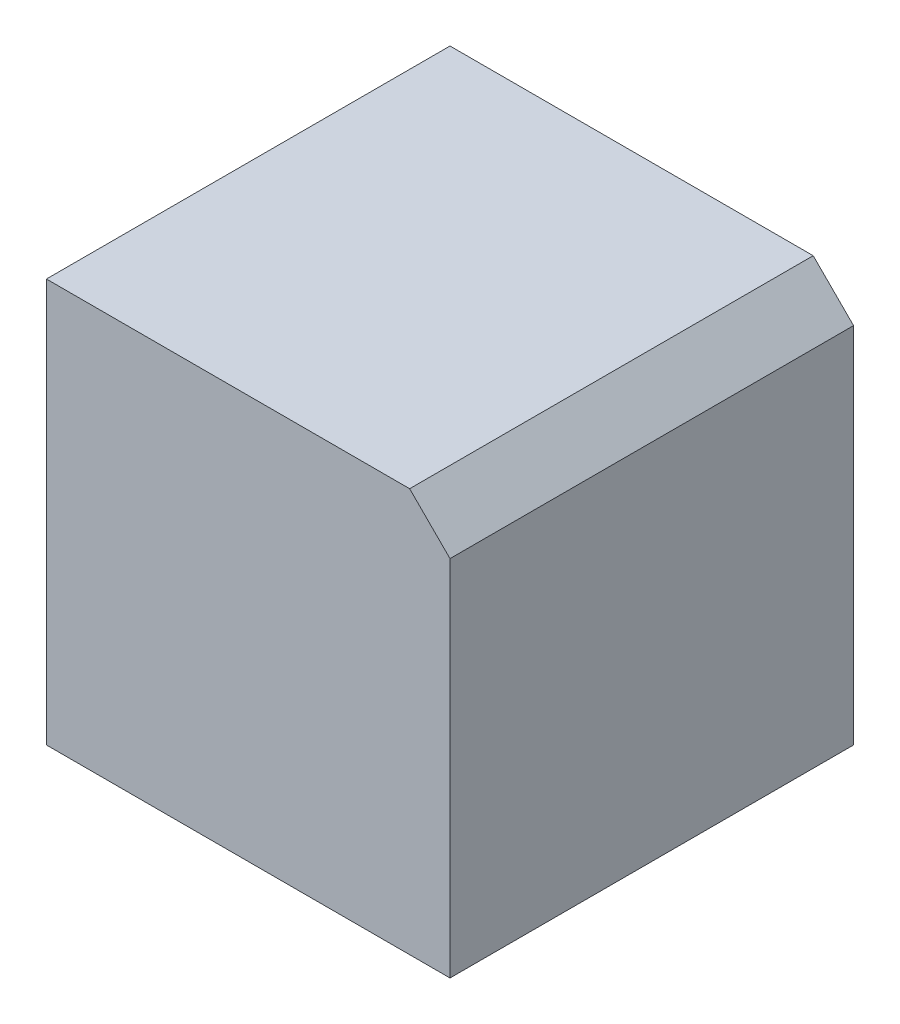
ISO-10303-21;
HEADER;
FILE_DESCRIPTION(('STEP AP214'),'2;1');
FILE_NAME('part.step','',(''),(''),'','','');
FILE_SCHEMA(('AUTOMOTIVE_DESIGN { 1 0 10303 214 1 1 1 1 }'));
ENDSEC;
DATA;
#1=APPLICATION_CONTEXT('core data for automotive mechanical design processes');
#2=APPLICATION_PROTOCOL_DEFINITION('international standard','automotive_design',2000,#1);
#3=PRODUCT_CONTEXT('',#1,'mechanical');
#4=PRODUCT('Part','Part','',(#3));
#5=PRODUCT_RELATED_PRODUCT_CATEGORY('part','',(#4));
#6=PRODUCT_DEFINITION_FORMATION('','',#4);
#7=PRODUCT_DEFINITION_CONTEXT('part definition',#1,'design');
#8=PRODUCT_DEFINITION('design','',#6,#7);
#9=PRODUCT_DEFINITION_SHAPE('','',#8);
#10=(LENGTH_UNIT() NAMED_UNIT(*) SI_UNIT(.MILLI.,.METRE.));
#11=(NAMED_UNIT(*) PLANE_ANGLE_UNIT() SI_UNIT($,.RADIAN.));
#12=(NAMED_UNIT(*) SI_UNIT($,.STERADIAN.) SOLID_ANGLE_UNIT());
#13=UNCERTAINTY_MEASURE_WITH_UNIT(LENGTH_MEASURE(1.E-05),#10,'distance_accuracy_value','');
#14=(GEOMETRIC_REPRESENTATION_CONTEXT(3) GLOBAL_UNCERTAINTY_ASSIGNED_CONTEXT((#13)) GLOBAL_UNIT_ASSIGNED_CONTEXT((#10,
#11,#12)) REPRESENTATION_CONTEXT('',''));
#15=CARTESIAN_POINT('',(0.,0.,0.));
#16=DIRECTION('',(0.,0.,1.));
#17=DIRECTION('',(1.,0.,0.));
#18=AXIS2_PLACEMENT_3D('',#15,#16,#17);
#19=CARTESIAN_POINT('',(0.,0.,10.));
#20=DIRECTION('',(1.,0.,0.));
#21=DIRECTION('',(0.,0.,-1.));
#22=AXIS2_PLACEMENT_3D('',#19,#20,#21);
#23=PLANE('',#22);
#24=DIRECTION('',(0.,-1.,0.));
#25=VECTOR('',#24,1.);
#26=CARTESIAN_POINT('',(0.,0.,0.));
#27=LINE('',#26,#25);
#28=CARTESIAN_POINT('',(0.,10.,0.));
#29=VERTEX_POINT('',#28);
#30=CARTESIAN_POINT('',(0.,0.,0.));
#31=VERTEX_POINT('',#30);
#32=EDGE_CURVE('E107',#29,#31,#27,.T.);
#33=ORIENTED_EDGE('',*,*,#32,.T.);
#34=DIRECTION('',(0.,0.,-1.));
#35=VECTOR('',#34,1.);
#36=CARTESIAN_POINT('',(0.,0.,10.));
#37=LINE('',#36,#35);
#38=CARTESIAN_POINT('',(0.,0.,10.));
#39=VERTEX_POINT('',#38);
#40=EDGE_CURVE('E89',#39,#31,#37,.T.);
#41=ORIENTED_EDGE('',*,*,#40,.F.);
#42=DIRECTION('',(0.,-1.,0.));
#43=VECTOR('',#42,1.);
#44=CARTESIAN_POINT('',(0.,0.,10.));
#45=LINE('',#44,#43);
#46=CARTESIAN_POINT('',(0.,10.,10.));
#47=VERTEX_POINT('',#46);
#48=EDGE_CURVE('E95',#47,#39,#45,.T.);
#49=ORIENTED_EDGE('',*,*,#48,.F.);
#50=DIRECTION('',(0.,0.,-1.));
#51=VECTOR('',#50,1.);
#52=CARTESIAN_POINT('',(0.,10.,10.));
#53=LINE('',#52,#51);
#54=EDGE_CURVE('E112',#47,#29,#53,.T.);
#55=ORIENTED_EDGE('',*,*,#54,.T.);
#56=EDGE_LOOP('',(#33,#41,#49,#55));
#57=FACE_BOUND('',#56,.T.);
#58=ADVANCED_FACE('F37',(#57),#23,.F.);
#59=CARTESIAN_POINT('',(0.,0.,10.));
#60=DIRECTION('',(0.,1.,0.));
#61=DIRECTION('',(0.,0.,1.));
#62=AXIS2_PLACEMENT_3D('',#59,#60,#61);
#63=PLANE('',#62);
#64=DIRECTION('',(1.,0.,0.));
#65=VECTOR('',#64,1.);
#66=CARTESIAN_POINT('',(0.,0.,0.));
#67=LINE('',#66,#65);
#68=CARTESIAN_POINT('',(10.,0.,0.));
#69=VERTEX_POINT('',#68);
#70=EDGE_CURVE('E120',#31,#69,#67,.T.);
#71=ORIENTED_EDGE('',*,*,#70,.T.);
#72=DIRECTION('',(0.,0.,-1.));
#73=VECTOR('',#72,1.);
#74=CARTESIAN_POINT('',(10.,0.,10.));
#75=LINE('',#74,#73);
#76=CARTESIAN_POINT('',(10.,0.,10.));
#77=VERTEX_POINT('',#76);
#78=EDGE_CURVE('E92',#77,#69,#75,.T.);
#79=ORIENTED_EDGE('',*,*,#78,.F.);
#80=DIRECTION('',(1.,0.,0.));
#81=VECTOR('',#80,1.);
#82=CARTESIAN_POINT('',(0.,0.,10.));
#83=LINE('',#82,#81);
#84=EDGE_CURVE('E85',#39,#77,#83,.T.);
#85=ORIENTED_EDGE('',*,*,#84,.F.);
#86=ORIENTED_EDGE('',*,*,#40,.T.);
#87=EDGE_LOOP('',(#71,#79,#85,#86));
#88=FACE_BOUND('',#87,.T.);
#89=ADVANCED_FACE('F87',(#88),#63,.F.);
#90=CARTESIAN_POINT('',(10.,0.,10.));
#91=DIRECTION('',(-1.,0.,0.));
#92=DIRECTION('',(0.,0.,1.));
#93=AXIS2_PLACEMENT_3D('',#90,#91,#92);
#94=PLANE('',#93);
#95=DIRECTION('',(0.,1.,0.));
#96=VECTOR('',#95,1.);
#97=CARTESIAN_POINT('',(10.,0.,0.));
#98=LINE('',#97,#96);
#99=CARTESIAN_POINT('',(10.,9.,0.));
#100=VERTEX_POINT('',#99);
#101=EDGE_CURVE('E118',#69,#100,#98,.T.);
#102=ORIENTED_EDGE('',*,*,#101,.T.);
#103=DIRECTION('',(0.,0.,1.));
#104=VECTOR('',#103,1.);
#105=CARTESIAN_POINT('',(10.,9.,10.));
#106=LINE('',#105,#104);
#107=CARTESIAN_POINT('',(10.,9.,10.));
#108=VERTEX_POINT('',#107);
#109=EDGE_CURVE('E46',#100,#108,#106,.T.);
#110=ORIENTED_EDGE('',*,*,#109,.T.);
#111=DIRECTION('',(0.,1.,0.));
#112=VECTOR('',#111,1.);
#113=CARTESIAN_POINT('',(10.,0.,10.));
#114=LINE('',#113,#112);
#115=EDGE_CURVE('E94',#77,#108,#114,.T.);
#116=ORIENTED_EDGE('',*,*,#115,.F.);
#117=ORIENTED_EDGE('',*,*,#78,.T.);
#118=EDGE_LOOP('',(#102,#110,#116,#117));
#119=FACE_BOUND('',#118,.T.);
#120=ADVANCED_FACE('F130',(#119),#94,.F.);
#121=CARTESIAN_POINT('',(0.,10.,10.));
#122=DIRECTION('',(0.,-1.,0.));
#123=DIRECTION('',(0.,0.,-1.));
#124=AXIS2_PLACEMENT_3D('',#121,#122,#123);
#125=PLANE('',#124);
#126=DIRECTION('',(-1.,0.,0.));
#127=VECTOR('',#126,1.);
#128=CARTESIAN_POINT('',(0.,10.,10.));
#129=LINE('',#128,#127);
#130=CARTESIAN_POINT('',(9.00000000000001,10.,10.));
#131=VERTEX_POINT('',#130);
#132=EDGE_CURVE('E100',#131,#47,#129,.T.);
#133=ORIENTED_EDGE('',*,*,#132,.F.);
#134=DIRECTION('',(0.,0.,-1.));
#135=VECTOR('',#134,1.);
#136=CARTESIAN_POINT('',(9.00000000000001,10.,10.));
#137=LINE('',#136,#135);
#138=CARTESIAN_POINT('',(9.00000000000001,10.,0.));
#139=VERTEX_POINT('',#138);
#140=EDGE_CURVE('E108',#131,#139,#137,.T.);
#141=ORIENTED_EDGE('',*,*,#140,.T.);
#142=DIRECTION('',(-1.,0.,0.));
#143=VECTOR('',#142,1.);
#144=CARTESIAN_POINT('',(0.,10.,0.));
#145=LINE('',#144,#143);
#146=EDGE_CURVE('E104',#139,#29,#145,.T.);
#147=ORIENTED_EDGE('',*,*,#146,.T.);
#148=ORIENTED_EDGE('',*,*,#54,.F.);
#149=EDGE_LOOP('',(#133,#141,#147,#148));
#150=FACE_BOUND('',#149,.T.);
#151=ADVANCED_FACE('F128',(#150),#125,.F.);
#152=CARTESIAN_POINT('',(0.,0.,10.));
#153=DIRECTION('',(0.,0.,-1.));
#154=DIRECTION('',(-1.,0.,0.));
#155=AXIS2_PLACEMENT_3D('',#152,#153,#154);
#156=PLANE('',#155);
#157=ORIENTED_EDGE('',*,*,#115,.T.);
#158=DIRECTION('',(0.707106781186545,-0.70710678118655,0.));
#159=VECTOR('',#158,1.);
#160=CARTESIAN_POINT('',(9.00000000000001,10.,10.));
#161=LINE('',#160,#159);
#162=EDGE_CURVE('E11',#108,#131,#161,.F.);
#163=ORIENTED_EDGE('',*,*,#162,.T.);
#164=ORIENTED_EDGE('',*,*,#132,.T.);
#165=ORIENTED_EDGE('',*,*,#48,.T.);
#166=ORIENTED_EDGE('',*,*,#84,.T.);
#167=EDGE_LOOP('',(#157,#163,#164,#165,#166));
#168=FACE_BOUND('',#167,.T.);
#169=ADVANCED_FACE('F98',(#168),#156,.F.);
#170=CARTESIAN_POINT('',(0.,0.,0.));
#171=DIRECTION('',(0.,0.,-1.));
#172=DIRECTION('',(-1.,0.,0.));
#173=AXIS2_PLACEMENT_3D('',#170,#171,#172);
#174=PLANE('',#173);
#175=ORIENTED_EDGE('',*,*,#146,.F.);
#176=DIRECTION('',(-0.707106781186545,0.70710678118655,0.));
#177=VECTOR('',#176,1.);
#178=CARTESIAN_POINT('',(9.50000000000003,9.49999999999997,0.));
#179=LINE('',#178,#177);
#180=EDGE_CURVE('E60',#139,#100,#179,.F.);
#181=ORIENTED_EDGE('',*,*,#180,.T.);
#182=ORIENTED_EDGE('',*,*,#101,.F.);
#183=ORIENTED_EDGE('',*,*,#70,.F.);
#184=ORIENTED_EDGE('',*,*,#32,.F.);
#185=EDGE_LOOP('',(#175,#181,#182,#183,#184));
#186=FACE_BOUND('',#185,.T.);
#187=ADVANCED_FACE('F129',(#186),#174,.T.);
#188=CARTESIAN_POINT('',(9.00000000000001,10.,10.));
#189=DIRECTION('',(-0.70710678118655,-0.707106781186545,0.));
#190=DIRECTION('',(0.,0.,-1.));
#191=AXIS2_PLACEMENT_3D('',#188,#189,#190);
#192=PLANE('',#191);
#193=ORIENTED_EDGE('',*,*,#162,.F.);
#194=ORIENTED_EDGE('',*,*,#109,.F.);
#195=ORIENTED_EDGE('',*,*,#180,.F.);
#196=ORIENTED_EDGE('',*,*,#140,.F.);
#197=EDGE_LOOP('',(#193,#194,#195,#196));
#198=FACE_BOUND('',#197,.T.);
#199=ADVANCED_FACE('F40',(#198),#192,.F.);
#200=CLOSED_SHELL('',(#58,#89,#120,#151,#169,#187,#199));
#201=MANIFOLD_SOLID_BREP('B2',#200);
#202=ADVANCED_BREP_SHAPE_REPRESENTATION('',(#18,#201),#14);
#203=SHAPE_DEFINITION_REPRESENTATION(#9,#202);
ENDSEC;
END-ISO-10303-21;
